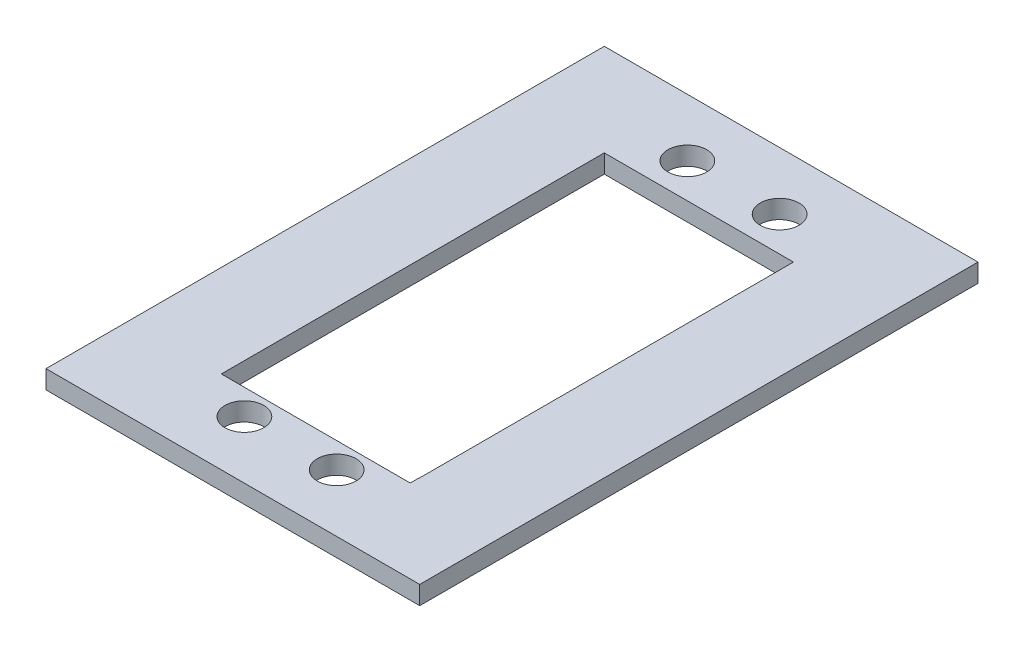
ISO-10303-21;
HEADER;
FILE_DESCRIPTION(('STEP AP214'),'2;1');
FILE_NAME('part.step','',(''),(''),'','','');
FILE_SCHEMA(('AUTOMOTIVE_DESIGN { 1 0 10303 214 1 1 1 1 }'));
ENDSEC;
DATA;
#1=APPLICATION_CONTEXT('core data for automotive mechanical design processes');
#2=APPLICATION_PROTOCOL_DEFINITION('international standard','automotive_design',2000,#1);
#3=PRODUCT_CONTEXT('',#1,'mechanical');
#4=PRODUCT('Part','Part','',(#3));
#5=PRODUCT_RELATED_PRODUCT_CATEGORY('part','',(#4));
#6=PRODUCT_DEFINITION_FORMATION('','',#4);
#7=PRODUCT_DEFINITION_CONTEXT('part definition',#1,'design');
#8=PRODUCT_DEFINITION('design','',#6,#7);
#9=PRODUCT_DEFINITION_SHAPE('','',#8);
#10=(LENGTH_UNIT() NAMED_UNIT(*) SI_UNIT(.MILLI.,.METRE.));
#11=(NAMED_UNIT(*) PLANE_ANGLE_UNIT() SI_UNIT($,.RADIAN.));
#12=(NAMED_UNIT(*) SI_UNIT($,.STERADIAN.) SOLID_ANGLE_UNIT());
#13=UNCERTAINTY_MEASURE_WITH_UNIT(LENGTH_MEASURE(1.E-05),#10,'distance_accuracy_value','');
#14=(GEOMETRIC_REPRESENTATION_CONTEXT(3) GLOBAL_UNCERTAINTY_ASSIGNED_CONTEXT((#13)) GLOBAL_UNIT_ASSIGNED_CONTEXT((#10,
#11,#12)) REPRESENTATION_CONTEXT('',''));
#15=CARTESIAN_POINT('',(0.,0.,0.));
#16=DIRECTION('',(0.,0.,1.));
#17=DIRECTION('',(1.,0.,0.));
#18=AXIS2_PLACEMENT_3D('',#15,#16,#17);
#19=CARTESIAN_POINT('',(-20.25,2.,0.));
#20=DIRECTION('',(-1.,0.,0.));
#21=DIRECTION('',(0.,0.,1.));
#22=AXIS2_PLACEMENT_3D('',#19,#20,#21);
#23=PLANE('',#22);
#24=DIRECTION('',(0.,0.,-1.));
#25=VECTOR('',#24,1.);
#26=CARTESIAN_POINT('',(-20.25,0.,0.));
#27=LINE('',#26,#25);
#28=CARTESIAN_POINT('',(-20.25,0.,30.25));
#29=VERTEX_POINT('',#28);
#30=CARTESIAN_POINT('',(-20.25,0.,-30.25));
#31=VERTEX_POINT('',#30);
#32=EDGE_CURVE('E185',#29,#31,#27,.T.);
#33=ORIENTED_EDGE('',*,*,#32,.F.);
#34=DIRECTION('',(0.,-1.,0.));
#35=VECTOR('',#34,1.);
#36=CARTESIAN_POINT('',(-20.25,2.,30.25));
#37=LINE('',#36,#35);
#38=CARTESIAN_POINT('',(-20.25,2.,30.25));
#39=VERTEX_POINT('',#38);
#40=EDGE_CURVE('E11',#39,#29,#37,.T.);
#41=ORIENTED_EDGE('',*,*,#40,.F.);
#42=DIRECTION('',(0.,0.,-1.));
#43=VECTOR('',#42,1.);
#44=CARTESIAN_POINT('',(-20.25,2.,0.));
#45=LINE('',#44,#43);
#46=CARTESIAN_POINT('',(-20.25,2.,-30.25));
#47=VERTEX_POINT('',#46);
#48=EDGE_CURVE('E143',#39,#47,#45,.T.);
#49=ORIENTED_EDGE('',*,*,#48,.T.);
#50=DIRECTION('',(0.,-1.,0.));
#51=VECTOR('',#50,1.);
#52=CARTESIAN_POINT('',(-20.25,2.,-30.25));
#53=LINE('',#52,#51);
#54=EDGE_CURVE('E74',#47,#31,#53,.T.);
#55=ORIENTED_EDGE('',*,*,#54,.T.);
#56=EDGE_LOOP('',(#33,#41,#49,#55));
#57=FACE_BOUND('',#56,.T.);
#58=ADVANCED_FACE('F47',(#57),#23,.T.);
#59=CARTESIAN_POINT('',(0.,2.,30.25));
#60=DIRECTION('',(0.,0.,-1.));
#61=DIRECTION('',(-1.,0.,0.));
#62=AXIS2_PLACEMENT_3D('',#59,#60,#61);
#63=PLANE('',#62);
#64=DIRECTION('',(1.,0.,0.));
#65=VECTOR('',#64,1.);
#66=CARTESIAN_POINT('',(0.,0.,30.25));
#67=LINE('',#66,#65);
#68=CARTESIAN_POINT('',(20.25,0.,30.25));
#69=VERTEX_POINT('',#68);
#70=EDGE_CURVE('E149',#29,#69,#67,.T.);
#71=ORIENTED_EDGE('',*,*,#70,.T.);
#72=DIRECTION('',(0.,-1.,0.));
#73=VECTOR('',#72,1.);
#74=CARTESIAN_POINT('',(20.25,2.,30.25));
#75=LINE('',#74,#73);
#76=CARTESIAN_POINT('',(20.25,2.,30.25));
#77=VERTEX_POINT('',#76);
#78=EDGE_CURVE('E57',#77,#69,#75,.T.);
#79=ORIENTED_EDGE('',*,*,#78,.F.);
#80=DIRECTION('',(1.,0.,0.));
#81=VECTOR('',#80,1.);
#82=CARTESIAN_POINT('',(0.,2.,30.25));
#83=LINE('',#82,#81);
#84=EDGE_CURVE('E137',#39,#77,#83,.T.);
#85=ORIENTED_EDGE('',*,*,#84,.F.);
#86=ORIENTED_EDGE('',*,*,#40,.T.);
#87=EDGE_LOOP('',(#71,#79,#85,#86));
#88=FACE_BOUND('',#87,.T.);
#89=ADVANCED_FACE('F147',(#88),#63,.F.);
#90=CARTESIAN_POINT('',(20.25,2.,0.));
#91=DIRECTION('',(-1.,0.,0.));
#92=DIRECTION('',(0.,0.,1.));
#93=AXIS2_PLACEMENT_3D('',#90,#91,#92);
#94=PLANE('',#93);
#95=DIRECTION('',(0.,0.,-1.));
#96=VECTOR('',#95,1.);
#97=CARTESIAN_POINT('',(20.25,0.,0.));
#98=LINE('',#97,#96);
#99=CARTESIAN_POINT('',(20.25,0.,-30.25));
#100=VERTEX_POINT('',#99);
#101=EDGE_CURVE('E180',#69,#100,#98,.T.);
#102=ORIENTED_EDGE('',*,*,#101,.T.);
#103=DIRECTION('',(0.,-1.,0.));
#104=VECTOR('',#103,1.);
#105=CARTESIAN_POINT('',(20.25,2.,-30.25));
#106=LINE('',#105,#104);
#107=CARTESIAN_POINT('',(20.25,2.,-30.25));
#108=VERTEX_POINT('',#107);
#109=EDGE_CURVE('E132',#108,#100,#106,.T.);
#110=ORIENTED_EDGE('',*,*,#109,.F.);
#111=DIRECTION('',(0.,0.,-1.));
#112=VECTOR('',#111,1.);
#113=CARTESIAN_POINT('',(20.25,2.,0.));
#114=LINE('',#113,#112);
#115=EDGE_CURVE('E126',#77,#108,#114,.T.);
#116=ORIENTED_EDGE('',*,*,#115,.F.);
#117=ORIENTED_EDGE('',*,*,#78,.T.);
#118=EDGE_LOOP('',(#102,#110,#116,#117));
#119=FACE_BOUND('',#118,.T.);
#120=ADVANCED_FACE('F129',(#119),#94,.F.);
#121=CARTESIAN_POINT('',(-10.25,2.,0.));
#122=DIRECTION('',(-1.,0.,0.));
#123=DIRECTION('',(0.,0.,1.));
#124=AXIS2_PLACEMENT_3D('',#121,#122,#123);
#125=PLANE('',#124);
#126=DIRECTION('',(0.,0.,-1.));
#127=VECTOR('',#126,1.);
#128=CARTESIAN_POINT('',(-10.25,0.,0.));
#129=LINE('',#128,#127);
#130=CARTESIAN_POINT('',(-10.25,0.,21.25));
#131=VERTEX_POINT('',#130);
#132=CARTESIAN_POINT('',(-10.25,0.,-20.25));
#133=VERTEX_POINT('',#132);
#134=EDGE_CURVE('E198',#131,#133,#129,.T.);
#135=ORIENTED_EDGE('',*,*,#134,.T.);
#136=DIRECTION('',(0.,-1.,0.));
#137=VECTOR('',#136,1.);
#138=CARTESIAN_POINT('',(-10.25,2.,-20.25));
#139=LINE('',#138,#137);
#140=CARTESIAN_POINT('',(-10.25,2.,-20.25));
#141=VERTEX_POINT('',#140);
#142=EDGE_CURVE('E51',#141,#133,#139,.T.);
#143=ORIENTED_EDGE('',*,*,#142,.F.);
#144=DIRECTION('',(0.,0.,-1.));
#145=VECTOR('',#144,1.);
#146=CARTESIAN_POINT('',(-10.25,2.,0.));
#147=LINE('',#146,#145);
#148=CARTESIAN_POINT('',(-10.25,2.,21.25));
#149=VERTEX_POINT('',#148);
#150=EDGE_CURVE('E229',#149,#141,#147,.T.);
#151=ORIENTED_EDGE('',*,*,#150,.F.);
#152=DIRECTION('',(0.,1.,0.));
#153=VECTOR('',#152,1.);
#154=CARTESIAN_POINT('',(-10.25,0.,21.25));
#155=LINE('',#154,#153);
#156=EDGE_CURVE('E243',#131,#149,#155,.T.);
#157=ORIENTED_EDGE('',*,*,#156,.F.);
#158=EDGE_LOOP('',(#135,#143,#151,#157));
#159=FACE_BOUND('',#158,.T.);
#160=ADVANCED_FACE('F295',(#159),#125,.F.);
#161=CARTESIAN_POINT('',(0.,2.,-20.25));
#162=DIRECTION('',(0.,0.,-1.));
#163=DIRECTION('',(-1.,0.,0.));
#164=AXIS2_PLACEMENT_3D('',#161,#162,#163);
#165=PLANE('',#164);
#166=DIRECTION('',(1.,0.,0.));
#167=VECTOR('',#166,1.);
#168=CARTESIAN_POINT('',(0.,0.,-20.25));
#169=LINE('',#168,#167);
#170=CARTESIAN_POINT('',(10.25,0.,-20.25));
#171=VERTEX_POINT('',#170);
#172=EDGE_CURVE('E195',#133,#171,#169,.T.);
#173=ORIENTED_EDGE('',*,*,#172,.T.);
#174=DIRECTION('',(0.,-1.,0.));
#175=VECTOR('',#174,1.);
#176=CARTESIAN_POINT('',(10.25,2.,-20.25));
#177=LINE('',#176,#175);
#178=CARTESIAN_POINT('',(10.25,2.,-20.25));
#179=VERTEX_POINT('',#178);
#180=EDGE_CURVE('E159',#179,#171,#177,.T.);
#181=ORIENTED_EDGE('',*,*,#180,.F.);
#182=DIRECTION('',(1.,0.,0.));
#183=VECTOR('',#182,1.);
#184=CARTESIAN_POINT('',(0.,2.,-20.25));
#185=LINE('',#184,#183);
#186=EDGE_CURVE('E110',#141,#179,#185,.T.);
#187=ORIENTED_EDGE('',*,*,#186,.F.);
#188=ORIENTED_EDGE('',*,*,#142,.T.);
#189=EDGE_LOOP('',(#173,#181,#187,#188));
#190=FACE_BOUND('',#189,.T.);
#191=ADVANCED_FACE('F293',(#190),#165,.F.);
#192=CARTESIAN_POINT('',(10.25,2.,0.));
#193=DIRECTION('',(-1.,0.,0.));
#194=DIRECTION('',(0.,0.,1.));
#195=AXIS2_PLACEMENT_3D('',#192,#193,#194);
#196=PLANE('',#195);
#197=DIRECTION('',(0.,0.,-1.));
#198=VECTOR('',#197,1.);
#199=CARTESIAN_POINT('',(10.25,0.,0.));
#200=LINE('',#199,#198);
#201=CARTESIAN_POINT('',(10.25,0.,20.25));
#202=VERTEX_POINT('',#201);
#203=EDGE_CURVE('E191',#202,#171,#200,.T.);
#204=ORIENTED_EDGE('',*,*,#203,.F.);
#205=DIRECTION('',(0.,-1.,0.));
#206=VECTOR('',#205,1.);
#207=CARTESIAN_POINT('',(10.25,2.,20.25));
#208=LINE('',#207,#206);
#209=CARTESIAN_POINT('',(10.25,2.,20.25));
#210=VERTEX_POINT('',#209);
#211=EDGE_CURVE('E156',#210,#202,#208,.T.);
#212=ORIENTED_EDGE('',*,*,#211,.F.);
#213=DIRECTION('',(0.,0.,-1.));
#214=VECTOR('',#213,1.);
#215=CARTESIAN_POINT('',(10.25,2.,0.));
#216=LINE('',#215,#214);
#217=EDGE_CURVE('E224',#210,#179,#216,.T.);
#218=ORIENTED_EDGE('',*,*,#217,.T.);
#219=ORIENTED_EDGE('',*,*,#180,.T.);
#220=EDGE_LOOP('',(#204,#212,#218,#219));
#221=FACE_BOUND('',#220,.T.);
#222=ADVANCED_FACE('F292',(#221),#196,.T.);
#223=CARTESIAN_POINT('',(0.,2.,-30.25));
#224=DIRECTION('',(0.,0.,-1.));
#225=DIRECTION('',(-1.,0.,0.));
#226=AXIS2_PLACEMENT_3D('',#223,#224,#225);
#227=PLANE('',#226);
#228=DIRECTION('',(1.,0.,0.));
#229=VECTOR('',#228,1.);
#230=CARTESIAN_POINT('',(0.,0.,-30.25));
#231=LINE('',#230,#229);
#232=EDGE_CURVE('E176',#31,#100,#231,.T.);
#233=ORIENTED_EDGE('',*,*,#232,.F.);
#234=ORIENTED_EDGE('',*,*,#54,.F.);
#235=DIRECTION('',(1.,0.,0.));
#236=VECTOR('',#235,1.);
#237=CARTESIAN_POINT('',(0.,2.,-30.25));
#238=LINE('',#237,#236);
#239=EDGE_CURVE('E136',#47,#108,#238,.T.);
#240=ORIENTED_EDGE('',*,*,#239,.T.);
#241=ORIENTED_EDGE('',*,*,#109,.T.);
#242=EDGE_LOOP('',(#233,#234,#240,#241));
#243=FACE_BOUND('',#242,.T.);
#244=ADVANCED_FACE('F301',(#243),#227,.T.);
#245=CARTESIAN_POINT('',(0.,2.,20.25));
#246=DIRECTION('',(0.,0.,-1.));
#247=DIRECTION('',(-1.,0.,0.));
#248=AXIS2_PLACEMENT_3D('',#245,#246,#247);
#249=PLANE('',#248);
#250=DIRECTION('',(0.,1.,0.));
#251=VECTOR('',#250,1.);
#252=CARTESIAN_POINT('',(10.2212445861026,0.,20.25));
#253=LINE('',#252,#251);
#254=CARTESIAN_POINT('',(10.2212445861026,0.,20.25));
#255=VERTEX_POINT('',#254);
#256=CARTESIAN_POINT('',(10.2212445861026,2.,20.25));
#257=VERTEX_POINT('',#256);
#258=EDGE_CURVE('E213',#255,#257,#253,.T.);
#259=ORIENTED_EDGE('',*,*,#258,.T.);
#260=DIRECTION('',(1.,0.,0.));
#261=VECTOR('',#260,1.);
#262=CARTESIAN_POINT('',(0.,2.,20.25));
#263=LINE('',#262,#261);
#264=EDGE_CURVE('E221',#257,#210,#263,.T.);
#265=ORIENTED_EDGE('',*,*,#264,.T.);
#266=ORIENTED_EDGE('',*,*,#211,.T.);
#267=DIRECTION('',(1.,0.,0.));
#268=VECTOR('',#267,1.);
#269=CARTESIAN_POINT('',(0.,0.,20.25));
#270=LINE('',#269,#268);
#271=EDGE_CURVE('E188',#255,#202,#270,.T.);
#272=ORIENTED_EDGE('',*,*,#271,.F.);
#273=EDGE_LOOP('',(#259,#265,#266,#272));
#274=FACE_BOUND('',#273,.T.);
#275=ADVANCED_FACE('F291',(#274),#249,.T.);
#276=CARTESIAN_POINT('',(5.,2.,24.));
#277=DIRECTION('',(0.,-1.,0.));
#278=DIRECTION('',(0.,0.,-1.));
#279=AXIS2_PLACEMENT_3D('',#276,#277,#278);
#280=CYLINDRICAL_SURFACE('',#279,2.1);
#281=CARTESIAN_POINT('',(5.,2.,24.));
#282=DIRECTION('',(0.,1.,0.));
#283=DIRECTION('',(0.,0.,1.));
#284=AXIS2_PLACEMENT_3D('',#281,#282,#283);
#285=CIRCLE('',#284,2.1);
#286=CARTESIAN_POINT('',(5.,2.,26.1));
#287=VERTEX_POINT('',#286);
#288=EDGE_CURVE('E232',#287,#287,#285,.F.);
#289=ORIENTED_EDGE('',*,*,#288,.F.);
#290=EDGE_LOOP('',(#289));
#291=FACE_BOUND('',#290,.T.);
#292=CARTESIAN_POINT('',(5.,0.,24.));
#293=DIRECTION('',(0.,1.,0.));
#294=DIRECTION('',(0.,0.,1.));
#295=AXIS2_PLACEMENT_3D('',#292,#293,#294);
#296=CIRCLE('',#295,2.1);
#297=CARTESIAN_POINT('',(5.,0.,26.1));
#298=VERTEX_POINT('',#297);
#299=EDGE_CURVE('E201',#298,#298,#296,.F.);
#300=ORIENTED_EDGE('',*,*,#299,.T.);
#301=EDGE_LOOP('',(#300));
#302=FACE_BOUND('',#301,.T.);
#303=ADVANCED_FACE('F315',(#291,#302),#280,.F.);
#304=CARTESIAN_POINT('',(-5.,2.,-24.));
#305=DIRECTION('',(0.,-1.,0.));
#306=DIRECTION('',(0.,0.,-1.));
#307=AXIS2_PLACEMENT_3D('',#304,#305,#306);
#308=CYLINDRICAL_SURFACE('',#307,2.1);
#309=CARTESIAN_POINT('',(-5.,2.,-24.));
#310=DIRECTION('',(0.,1.,0.));
#311=DIRECTION('',(0.,0.,1.));
#312=AXIS2_PLACEMENT_3D('',#309,#310,#311);
#313=CIRCLE('',#312,2.1);
#314=CARTESIAN_POINT('',(-5.,2.,-21.9));
#315=VERTEX_POINT('',#314);
#316=EDGE_CURVE('E236',#315,#315,#313,.T.);
#317=ORIENTED_EDGE('',*,*,#316,.T.);
#318=EDGE_LOOP('',(#317));
#319=FACE_BOUND('',#318,.T.);
#320=CARTESIAN_POINT('',(-5.,0.,-24.));
#321=DIRECTION('',(0.,1.,0.));
#322=DIRECTION('',(0.,0.,1.));
#323=AXIS2_PLACEMENT_3D('',#320,#321,#322);
#324=CIRCLE('',#323,2.1);
#325=CARTESIAN_POINT('',(-5.,0.,-21.9));
#326=VERTEX_POINT('',#325);
#327=EDGE_CURVE('E205',#326,#326,#324,.T.);
#328=ORIENTED_EDGE('',*,*,#327,.F.);
#329=EDGE_LOOP('',(#328));
#330=FACE_BOUND('',#329,.T.);
#331=ADVANCED_FACE('F320',(#319,#330),#308,.F.);
#332=CARTESIAN_POINT('',(5.,2.,-24.));
#333=DIRECTION('',(0.,-1.,0.));
#334=DIRECTION('',(0.,0.,-1.));
#335=AXIS2_PLACEMENT_3D('',#332,#333,#334);
#336=CYLINDRICAL_SURFACE('',#335,2.1);
#337=CARTESIAN_POINT('',(5.,2.,-24.));
#338=DIRECTION('',(0.,1.,0.));
#339=DIRECTION('',(0.,0.,1.));
#340=AXIS2_PLACEMENT_3D('',#337,#338,#339);
#341=CIRCLE('',#340,2.1);
#342=CARTESIAN_POINT('',(5.,2.,-21.9));
#343=VERTEX_POINT('',#342);
#344=EDGE_CURVE('E175',#343,#343,#341,.T.);
#345=ORIENTED_EDGE('',*,*,#344,.T.);
#346=EDGE_LOOP('',(#345));
#347=FACE_BOUND('',#346,.T.);
#348=CARTESIAN_POINT('',(5.,0.,-24.));
#349=DIRECTION('',(0.,1.,0.));
#350=DIRECTION('',(0.,0.,1.));
#351=AXIS2_PLACEMENT_3D('',#348,#349,#350);
#352=CIRCLE('',#351,2.1);
#353=CARTESIAN_POINT('',(5.,0.,-21.9));
#354=VERTEX_POINT('',#353);
#355=EDGE_CURVE('E209',#354,#354,#352,.T.);
#356=ORIENTED_EDGE('',*,*,#355,.F.);
#357=EDGE_LOOP('',(#356));
#358=FACE_BOUND('',#357,.T.);
#359=ADVANCED_FACE('F49',(#347,#358),#336,.F.);
#360=CARTESIAN_POINT('',(-5.,2.,24.));
#361=DIRECTION('',(0.,-1.,0.));
#362=DIRECTION('',(0.,0.,-1.));
#363=AXIS2_PLACEMENT_3D('',#360,#361,#362);
#364=CYLINDRICAL_SURFACE('',#363,2.1);
#365=CARTESIAN_POINT('',(-5.,2.,24.));
#366=DIRECTION('',(0.,1.,0.));
#367=DIRECTION('',(0.,0.,1.));
#368=AXIS2_PLACEMENT_3D('',#365,#366,#367);
#369=CIRCLE('',#368,2.1);
#370=CARTESIAN_POINT('',(-5.,2.,26.1));
#371=VERTEX_POINT('',#370);
#372=EDGE_CURVE('E160',#371,#371,#369,.F.);
#373=ORIENTED_EDGE('',*,*,#372,.F.);
#374=EDGE_LOOP('',(#373));
#375=FACE_BOUND('',#374,.T.);
#376=CARTESIAN_POINT('',(-5.,0.,24.));
#377=DIRECTION('',(0.,1.,0.));
#378=DIRECTION('',(0.,0.,1.));
#379=AXIS2_PLACEMENT_3D('',#376,#377,#378);
#380=CIRCLE('',#379,2.1);
#381=CARTESIAN_POINT('',(-5.,0.,26.1));
#382=VERTEX_POINT('',#381);
#383=EDGE_CURVE('E171',#382,#382,#380,.F.);
#384=ORIENTED_EDGE('',*,*,#383,.T.);
#385=EDGE_LOOP('',(#384));
#386=FACE_BOUND('',#385,.T.);
#387=ADVANCED_FACE('F328',(#375,#386),#364,.F.);
#388=CARTESIAN_POINT('',(0.,2.,0.));
#389=DIRECTION('',(0.,1.,0.));
#390=DIRECTION('',(0.,0.,1.));
#391=AXIS2_PLACEMENT_3D('',#388,#389,#390);
#392=PLANE('',#391);
#393=DIRECTION('',(1.,0.,0.));
#394=VECTOR('',#393,1.);
#395=CARTESIAN_POINT('',(-10.25,2.,21.25));
#396=LINE('',#395,#394);
#397=CARTESIAN_POINT('',(10.2212445861026,2.,21.25));
#398=VERTEX_POINT('',#397);
#399=EDGE_CURVE('E258',#149,#398,#396,.T.);
#400=ORIENTED_EDGE('',*,*,#399,.F.);
#401=ORIENTED_EDGE('',*,*,#150,.T.);
#402=ORIENTED_EDGE('',*,*,#186,.T.);
#403=ORIENTED_EDGE('',*,*,#217,.F.);
#404=ORIENTED_EDGE('',*,*,#264,.F.);
#405=DIRECTION('',(0.,0.,-1.));
#406=VECTOR('',#405,1.);
#407=CARTESIAN_POINT('',(10.2212445861026,2.,20.25));
#408=LINE('',#407,#406);
#409=EDGE_CURVE('E253',#398,#257,#408,.T.);
#410=ORIENTED_EDGE('',*,*,#409,.F.);
#411=EDGE_LOOP('',(#400,#401,#402,#403,#404,#410));
#412=FACE_BOUND('',#411,.T.);
#413=ORIENTED_EDGE('',*,*,#344,.F.);
#414=EDGE_LOOP('',(#413));
#415=FACE_BOUND('',#414,.T.);
#416=ORIENTED_EDGE('',*,*,#316,.F.);
#417=EDGE_LOOP('',(#416));
#418=FACE_BOUND('',#417,.T.);
#419=ORIENTED_EDGE('',*,*,#288,.T.);
#420=EDGE_LOOP('',(#419));
#421=FACE_BOUND('',#420,.T.);
#422=ORIENTED_EDGE('',*,*,#48,.F.);
#423=ORIENTED_EDGE('',*,*,#84,.T.);
#424=ORIENTED_EDGE('',*,*,#115,.T.);
#425=ORIENTED_EDGE('',*,*,#239,.F.);
#426=EDGE_LOOP('',(#422,#423,#424,#425));
#427=FACE_BOUND('',#426,.T.);
#428=ORIENTED_EDGE('',*,*,#372,.T.);
#429=EDGE_LOOP('',(#428));
#430=FACE_BOUND('',#429,.T.);
#431=ADVANCED_FACE('F141',(#412,#415,#418,#421,#427,#430),#392,.T.);
#432=CARTESIAN_POINT('',(0.,0.,0.));
#433=DIRECTION('',(0.,1.,0.));
#434=DIRECTION('',(0.,0.,1.));
#435=AXIS2_PLACEMENT_3D('',#432,#433,#434);
#436=PLANE('',#435);
#437=ORIENTED_EDGE('',*,*,#134,.F.);
#438=DIRECTION('',(1.,0.,0.));
#439=VECTOR('',#438,1.);
#440=CARTESIAN_POINT('',(-10.25,0.,21.25));
#441=LINE('',#440,#439);
#442=CARTESIAN_POINT('',(10.2212445861026,0.,21.25));
#443=VERTEX_POINT('',#442);
#444=EDGE_CURVE('E257',#131,#443,#441,.T.);
#445=ORIENTED_EDGE('',*,*,#444,.T.);
#446=DIRECTION('',(0.,0.,-1.));
#447=VECTOR('',#446,1.);
#448=CARTESIAN_POINT('',(10.2212445861026,0.,20.25));
#449=LINE('',#448,#447);
#450=EDGE_CURVE('E65',#443,#255,#449,.T.);
#451=ORIENTED_EDGE('',*,*,#450,.T.);
#452=ORIENTED_EDGE('',*,*,#271,.T.);
#453=ORIENTED_EDGE('',*,*,#203,.T.);
#454=ORIENTED_EDGE('',*,*,#172,.F.);
#455=EDGE_LOOP('',(#437,#445,#451,#452,#453,#454));
#456=FACE_BOUND('',#455,.T.);
#457=ORIENTED_EDGE('',*,*,#355,.T.);
#458=EDGE_LOOP('',(#457));
#459=FACE_BOUND('',#458,.T.);
#460=ORIENTED_EDGE('',*,*,#327,.T.);
#461=EDGE_LOOP('',(#460));
#462=FACE_BOUND('',#461,.T.);
#463=ORIENTED_EDGE('',*,*,#299,.F.);
#464=EDGE_LOOP('',(#463));
#465=FACE_BOUND('',#464,.T.);
#466=ORIENTED_EDGE('',*,*,#32,.T.);
#467=ORIENTED_EDGE('',*,*,#232,.T.);
#468=ORIENTED_EDGE('',*,*,#101,.F.);
#469=ORIENTED_EDGE('',*,*,#70,.F.);
#470=EDGE_LOOP('',(#466,#467,#468,#469));
#471=FACE_BOUND('',#470,.T.);
#472=ORIENTED_EDGE('',*,*,#383,.F.);
#473=EDGE_LOOP('',(#472));
#474=FACE_BOUND('',#473,.T.);
#475=ADVANCED_FACE('F269',(#456,#459,#462,#465,#471,#474),#436,.F.);
#476=CARTESIAN_POINT('',(10.2212445861026,0.,20.25));
#477=DIRECTION('',(1.,0.,0.));
#478=DIRECTION('',(0.,0.,-1.));
#479=AXIS2_PLACEMENT_3D('',#476,#477,#478);
#480=PLANE('',#479);
#481=ORIENTED_EDGE('',*,*,#409,.T.);
#482=ORIENTED_EDGE('',*,*,#258,.F.);
#483=ORIENTED_EDGE('',*,*,#450,.F.);
#484=DIRECTION('',(0.,1.,0.));
#485=VECTOR('',#484,1.);
#486=CARTESIAN_POINT('',(10.2212445861026,0.,21.25));
#487=LINE('',#486,#485);
#488=EDGE_CURVE('E247',#443,#398,#487,.T.);
#489=ORIENTED_EDGE('',*,*,#488,.T.);
#490=EDGE_LOOP('',(#481,#482,#483,#489));
#491=FACE_BOUND('',#490,.T.);
#492=ADVANCED_FACE('F283',(#491),#480,.F.);
#493=CARTESIAN_POINT('',(-10.25,0.,21.25));
#494=DIRECTION('',(0.,0.,1.));
#495=DIRECTION('',(1.,0.,0.));
#496=AXIS2_PLACEMENT_3D('',#493,#494,#495);
#497=PLANE('',#496);
#498=ORIENTED_EDGE('',*,*,#399,.T.);
#499=ORIENTED_EDGE('',*,*,#488,.F.);
#500=ORIENTED_EDGE('',*,*,#444,.F.);
#501=ORIENTED_EDGE('',*,*,#156,.T.);
#502=EDGE_LOOP('',(#498,#499,#500,#501));
#503=FACE_BOUND('',#502,.T.);
#504=ADVANCED_FACE('F275',(#503),#497,.F.);
#505=CLOSED_SHELL('',(#58,#89,#120,#160,#191,#222,#244,#275,#303,#331,#359,#387,#431,#475,#492,#504));
#506=MANIFOLD_SOLID_BREP('B2',#505);
#507=ADVANCED_BREP_SHAPE_REPRESENTATION('',(#18,#506),#14);
#508=SHAPE_DEFINITION_REPRESENTATION(#9,#507);
ENDSEC;
END-ISO-10303-21;
